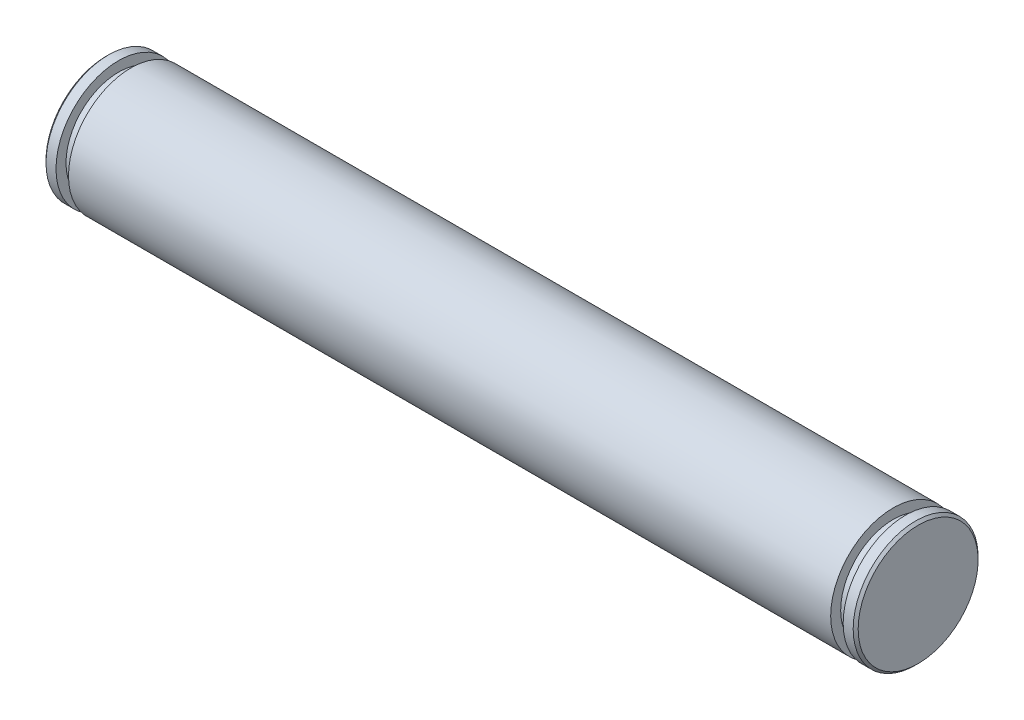
ISO-10303-21;
HEADER;
FILE_DESCRIPTION(('STEP AP214'),'2;1');
FILE_NAME('part.step','',(''),(''),'','','');
FILE_SCHEMA(('AUTOMOTIVE_DESIGN { 1 0 10303 214 1 1 1 1 }'));
ENDSEC;
DATA;
#1=APPLICATION_CONTEXT('core data for automotive mechanical design processes');
#2=APPLICATION_PROTOCOL_DEFINITION('international standard','automotive_design',2000,#1);
#3=PRODUCT_CONTEXT('',#1,'mechanical');
#4=PRODUCT('Part','Part','',(#3));
#5=PRODUCT_RELATED_PRODUCT_CATEGORY('part','',(#4));
#6=PRODUCT_DEFINITION_FORMATION('','',#4);
#7=PRODUCT_DEFINITION_CONTEXT('part definition',#1,'design');
#8=PRODUCT_DEFINITION('design','',#6,#7);
#9=PRODUCT_DEFINITION_SHAPE('','',#8);
#10=(LENGTH_UNIT() NAMED_UNIT(*) SI_UNIT(.MILLI.,.METRE.));
#11=(NAMED_UNIT(*) PLANE_ANGLE_UNIT() SI_UNIT($,.RADIAN.));
#12=(NAMED_UNIT(*) SI_UNIT($,.STERADIAN.) SOLID_ANGLE_UNIT());
#13=UNCERTAINTY_MEASURE_WITH_UNIT(LENGTH_MEASURE(1.E-05),#10,'distance_accuracy_value','');
#14=(GEOMETRIC_REPRESENTATION_CONTEXT(3) GLOBAL_UNCERTAINTY_ASSIGNED_CONTEXT((#13)) GLOBAL_UNIT_ASSIGNED_CONTEXT((#10,
#11,#12)) REPRESENTATION_CONTEXT('',''));
#15=CARTESIAN_POINT('',(0.,0.,0.));
#16=DIRECTION('',(0.,0.,1.));
#17=DIRECTION('',(1.,0.,0.));
#18=AXIS2_PLACEMENT_3D('',#15,#16,#17);
#19=CARTESIAN_POINT('',(65.,4.8,0.));
#20=DIRECTION('',(-1.,0.,0.));
#21=DIRECTION('',(0.,0.,1.));
#22=AXIS2_PLACEMENT_3D('',#19,#20,#21);
#23=PLANE('',#22);
#24=CARTESIAN_POINT('',(64.9999999999409,0.,0.));
#25=DIRECTION('',(-1.,0.,0.));
#26=DIRECTION('',(0.,0.,1.));
#27=AXIS2_PLACEMENT_3D('',#24,#25,#26);
#28=CIRCLE('',#27,4.80000000004566);
#29=CARTESIAN_POINT('',(64.9999999999409,0.,4.80000000004566));
#30=VERTEX_POINT('',#29);
#31=EDGE_CURVE('E17',#30,#30,#28,.T.);
#32=ORIENTED_EDGE('',*,*,#31,.F.);
#33=EDGE_LOOP('',(#32));
#34=FACE_BOUND('',#33,.T.);
#35=ADVANCED_FACE('F14',(#34),#23,.F.);
#36=CARTESIAN_POINT('',(0.,0.,0.));
#37=DIRECTION('',(1.,0.,0.));
#38=DIRECTION('',(0.,0.,-1.));
#39=AXIS2_PLACEMENT_3D('',#36,#37,#38);
#40=PLANE('',#39);
#41=CARTESIAN_POINT('',(5.6843418860808E-11,0.,0.));
#42=DIRECTION('',(1.,0.,0.));
#43=DIRECTION('',(0.,0.,-1.));
#44=AXIS2_PLACEMENT_3D('',#41,#42,#43);
#45=CIRCLE('',#44,4.79999999998881);
#46=CARTESIAN_POINT('',(5.6843418860808E-11,0.,-4.79999999998881));
#47=VERTEX_POINT('',#46);
#48=EDGE_CURVE('E49',#47,#47,#45,.T.);
#49=ORIENTED_EDGE('',*,*,#48,.F.);
#50=EDGE_LOOP('',(#49));
#51=FACE_BOUND('',#50,.T.);
#52=ADVANCED_FACE('F60',(#51),#40,.F.);
#53=CARTESIAN_POINT('',(64.7999999999911,0.,0.));
#54=DIRECTION('',(-1.,0.,0.));
#55=DIRECTION('',(0.,0.,1.));
#56=AXIS2_PLACEMENT_3D('',#53,#54,#55);
#57=CONICAL_SURFACE('',#56,4.99999999993861,0.78539816325534);
#58=CARTESIAN_POINT('',(64.8,0.,0.));
#59=DIRECTION('',(-1.,0.,0.));
#60=DIRECTION('',(0.,0.,1.));
#61=AXIS2_PLACEMENT_3D('',#58,#59,#60);
#62=CIRCLE('',#61,5.);
#63=CARTESIAN_POINT('',(64.8,0.,5.));
#64=VERTEX_POINT('',#63);
#65=EDGE_CURVE('E29',#64,#64,#62,.T.);
#66=ORIENTED_EDGE('',*,*,#65,.F.);
#67=EDGE_LOOP('',(#66));
#68=FACE_BOUND('',#67,.T.);
#69=ORIENTED_EDGE('',*,*,#31,.T.);
#70=EDGE_LOOP('',(#69));
#71=FACE_BOUND('',#70,.T.);
#72=ADVANCED_FACE('F57',(#68,#71),#57,.T.);
#73=CARTESIAN_POINT('',(0.200000000006639,0.,0.));
#74=DIRECTION('',(1.,0.,0.));
#75=DIRECTION('',(0.,0.,-1.));
#76=AXIS2_PLACEMENT_3D('',#73,#74,#75);
#77=CONICAL_SURFACE('',#76,4.99999999993861,0.785398163397448);
#78=CARTESIAN_POINT('',(0.200000000000006,0.,0.));
#79=DIRECTION('',(-1.,0.,0.));
#80=DIRECTION('',(0.,0.,1.));
#81=AXIS2_PLACEMENT_3D('',#78,#79,#80);
#82=CIRCLE('',#81,5.);
#83=CARTESIAN_POINT('',(0.200000000000006,0.,5.));
#84=VERTEX_POINT('',#83);
#85=EDGE_CURVE('E48',#84,#84,#82,.F.);
#86=ORIENTED_EDGE('',*,*,#85,.F.);
#87=EDGE_LOOP('',(#86));
#88=FACE_BOUND('',#87,.T.);
#89=ORIENTED_EDGE('',*,*,#48,.T.);
#90=EDGE_LOOP('',(#89));
#91=FACE_BOUND('',#90,.T.);
#92=ADVANCED_FACE('F105',(#88,#91),#77,.T.);
#93=CARTESIAN_POINT('',(-138.084352936582,0.,0.));
#94=DIRECTION('',(-1.,0.,0.));
#95=DIRECTION('',(0.,0.,1.));
#96=AXIS2_PLACEMENT_3D('',#93,#94,#95);
#97=CYLINDRICAL_SURFACE('',#96,5.);
#98=CARTESIAN_POINT('',(64.,0.,0.));
#99=DIRECTION('',(-1.,0.,0.));
#100=DIRECTION('',(0.,0.,1.));
#101=AXIS2_PLACEMENT_3D('',#98,#99,#100);
#102=CIRCLE('',#101,5.);
#103=CARTESIAN_POINT('',(64.,0.,5.));
#104=VERTEX_POINT('',#103);
#105=EDGE_CURVE('E46',#104,#104,#102,.F.);
#106=ORIENTED_EDGE('',*,*,#105,.T.);
#107=EDGE_LOOP('',(#106));
#108=FACE_BOUND('',#107,.T.);
#109=ORIENTED_EDGE('',*,*,#65,.T.);
#110=EDGE_LOOP('',(#109));
#111=FACE_BOUND('',#110,.T.);
#112=ADVANCED_FACE('F101',(#108,#111),#97,.T.);
#113=CARTESIAN_POINT('',(-138.084352936582,0.,0.));
#114=DIRECTION('',(-1.,0.,0.));
#115=DIRECTION('',(0.,0.,1.));
#116=AXIS2_PLACEMENT_3D('',#113,#114,#115);
#117=CYLINDRICAL_SURFACE('',#116,5.);
#118=ORIENTED_EDGE('',*,*,#85,.T.);
#119=EDGE_LOOP('',(#118));
#120=FACE_BOUND('',#119,.T.);
#121=CARTESIAN_POINT('',(1.,0.,0.));
#122=DIRECTION('',(-1.,0.,0.));
#123=DIRECTION('',(0.,0.,1.));
#124=AXIS2_PLACEMENT_3D('',#121,#122,#123);
#125=CIRCLE('',#124,5.);
#126=CARTESIAN_POINT('',(1.,0.,5.));
#127=VERTEX_POINT('',#126);
#128=EDGE_CURVE('E43',#127,#127,#125,.T.);
#129=ORIENTED_EDGE('',*,*,#128,.T.);
#130=EDGE_LOOP('',(#129));
#131=FACE_BOUND('',#130,.T.);
#132=ADVANCED_FACE('F97',(#120,#131),#117,.T.);
#133=CARTESIAN_POINT('',(64.,4.2,0.));
#134=DIRECTION('',(1.,0.,0.));
#135=DIRECTION('',(0.,0.,-1.));
#136=AXIS2_PLACEMENT_3D('',#133,#134,#135);
#137=PLANE('',#136);
#138=ORIENTED_EDGE('',*,*,#105,.F.);
#139=EDGE_LOOP('',(#138));
#140=FACE_BOUND('',#139,.T.);
#141=CARTESIAN_POINT('',(64.,0.,0.));
#142=DIRECTION('',(-1.,0.,0.));
#143=DIRECTION('',(0.,0.,1.));
#144=AXIS2_PLACEMENT_3D('',#141,#142,#143);
#145=CIRCLE('',#144,4.2);
#146=CARTESIAN_POINT('',(64.,0.,4.2));
#147=VERTEX_POINT('',#146);
#148=EDGE_CURVE('E40',#147,#147,#145,.T.);
#149=ORIENTED_EDGE('',*,*,#148,.F.);
#150=EDGE_LOOP('',(#149));
#151=FACE_BOUND('',#150,.T.);
#152=ADVANCED_FACE('F93',(#140,#151),#137,.F.);
#153=CARTESIAN_POINT('',(1.,5.,0.));
#154=DIRECTION('',(-1.,0.,0.));
#155=DIRECTION('',(0.,0.,1.));
#156=AXIS2_PLACEMENT_3D('',#153,#154,#155);
#157=PLANE('',#156);
#158=CARTESIAN_POINT('',(1.,0.,0.));
#159=DIRECTION('',(-1.,0.,0.));
#160=DIRECTION('',(0.,0.,1.));
#161=AXIS2_PLACEMENT_3D('',#158,#159,#160);
#162=CIRCLE('',#161,4.2);
#163=CARTESIAN_POINT('',(1.,0.,4.2));
#164=VERTEX_POINT('',#163);
#165=EDGE_CURVE('E37',#164,#164,#162,.F.);
#166=ORIENTED_EDGE('',*,*,#165,.F.);
#167=EDGE_LOOP('',(#166));
#168=FACE_BOUND('',#167,.T.);
#169=ORIENTED_EDGE('',*,*,#128,.F.);
#170=EDGE_LOOP('',(#169));
#171=FACE_BOUND('',#170,.T.);
#172=ADVANCED_FACE('F89',(#168,#171),#157,.F.);
#173=CARTESIAN_POINT('',(-138.084352936582,0.,0.));
#174=DIRECTION('',(-1.,0.,0.));
#175=DIRECTION('',(0.,0.,1.));
#176=AXIS2_PLACEMENT_3D('',#173,#174,#175);
#177=CYLINDRICAL_SURFACE('',#176,4.2);
#178=CARTESIAN_POINT('',(63.,0.,0.));
#179=DIRECTION('',(-1.,0.,0.));
#180=DIRECTION('',(0.,0.,1.));
#181=AXIS2_PLACEMENT_3D('',#178,#179,#180);
#182=CIRCLE('',#181,4.2);
#183=CARTESIAN_POINT('',(63.,0.,4.2));
#184=VERTEX_POINT('',#183);
#185=EDGE_CURVE('E34',#184,#184,#182,.F.);
#186=ORIENTED_EDGE('',*,*,#185,.T.);
#187=EDGE_LOOP('',(#186));
#188=FACE_BOUND('',#187,.T.);
#189=ORIENTED_EDGE('',*,*,#148,.T.);
#190=EDGE_LOOP('',(#189));
#191=FACE_BOUND('',#190,.T.);
#192=ADVANCED_FACE('F85',(#188,#191),#177,.T.);
#193=CARTESIAN_POINT('',(-138.084352936582,0.,0.));
#194=DIRECTION('',(-1.,0.,0.));
#195=DIRECTION('',(0.,0.,1.));
#196=AXIS2_PLACEMENT_3D('',#193,#194,#195);
#197=CYLINDRICAL_SURFACE('',#196,4.2);
#198=ORIENTED_EDGE('',*,*,#165,.T.);
#199=EDGE_LOOP('',(#198));
#200=FACE_BOUND('',#199,.T.);
#201=CARTESIAN_POINT('',(2.,0.,0.));
#202=DIRECTION('',(-1.,0.,0.));
#203=DIRECTION('',(0.,0.,1.));
#204=AXIS2_PLACEMENT_3D('',#201,#202,#203);
#205=CIRCLE('',#204,4.2);
#206=CARTESIAN_POINT('',(2.,0.,4.2));
#207=VERTEX_POINT('',#206);
#208=EDGE_CURVE('E26',#207,#207,#205,.T.);
#209=ORIENTED_EDGE('',*,*,#208,.T.);
#210=EDGE_LOOP('',(#209));
#211=FACE_BOUND('',#210,.T.);
#212=ADVANCED_FACE('F81',(#200,#211),#197,.T.);
#213=CARTESIAN_POINT('',(63.,5.,0.));
#214=DIRECTION('',(-1.,0.,0.));
#215=DIRECTION('',(0.,0.,1.));
#216=AXIS2_PLACEMENT_3D('',#213,#214,#215);
#217=PLANE('',#216);
#218=ORIENTED_EDGE('',*,*,#185,.F.);
#219=EDGE_LOOP('',(#218));
#220=FACE_BOUND('',#219,.T.);
#221=CARTESIAN_POINT('',(63.,0.,0.));
#222=DIRECTION('',(-1.,0.,0.));
#223=DIRECTION('',(0.,0.,1.));
#224=AXIS2_PLACEMENT_3D('',#221,#222,#223);
#225=CIRCLE('',#224,5.);
#226=CARTESIAN_POINT('',(63.,0.,5.));
#227=VERTEX_POINT('',#226);
#228=EDGE_CURVE('E21',#227,#227,#225,.T.);
#229=ORIENTED_EDGE('',*,*,#228,.F.);
#230=EDGE_LOOP('',(#229));
#231=FACE_BOUND('',#230,.T.);
#232=ADVANCED_FACE('F74',(#220,#231),#217,.F.);
#233=CARTESIAN_POINT('',(2.,4.2,0.));
#234=DIRECTION('',(1.,0.,0.));
#235=DIRECTION('',(0.,0.,-1.));
#236=AXIS2_PLACEMENT_3D('',#233,#234,#235);
#237=PLANE('',#236);
#238=CARTESIAN_POINT('',(2.,0.,0.));
#239=DIRECTION('',(-1.,0.,0.));
#240=DIRECTION('',(0.,0.,1.));
#241=AXIS2_PLACEMENT_3D('',#238,#239,#240);
#242=CIRCLE('',#241,5.);
#243=CARTESIAN_POINT('',(2.,0.,5.));
#244=VERTEX_POINT('',#243);
#245=EDGE_CURVE('E10',#244,#244,#242,.F.);
#246=ORIENTED_EDGE('',*,*,#245,.F.);
#247=EDGE_LOOP('',(#246));
#248=FACE_BOUND('',#247,.T.);
#249=ORIENTED_EDGE('',*,*,#208,.F.);
#250=EDGE_LOOP('',(#249));
#251=FACE_BOUND('',#250,.T.);
#252=ADVANCED_FACE('F68',(#248,#251),#237,.F.);
#253=CARTESIAN_POINT('',(-138.084352936582,0.,0.));
#254=DIRECTION('',(-1.,0.,0.));
#255=DIRECTION('',(0.,0.,1.));
#256=AXIS2_PLACEMENT_3D('',#253,#254,#255);
#257=CYLINDRICAL_SURFACE('',#256,5.);
#258=ORIENTED_EDGE('',*,*,#245,.T.);
#259=EDGE_LOOP('',(#258));
#260=FACE_BOUND('',#259,.T.);
#261=ORIENTED_EDGE('',*,*,#228,.T.);
#262=EDGE_LOOP('',(#261));
#263=FACE_BOUND('',#262,.T.);
#264=ADVANCED_FACE('F66',(#260,#263),#257,.T.);
#265=CLOSED_SHELL('',(#35,#52,#72,#92,#112,#132,#152,#172,#192,#212,#232,#252,#264));
#266=MANIFOLD_SOLID_BREP('B1',#265);
#267=ADVANCED_BREP_SHAPE_REPRESENTATION('',(#18,#266),#14);
#268=SHAPE_DEFINITION_REPRESENTATION(#9,#267);
ENDSEC;
END-ISO-10303-21;
